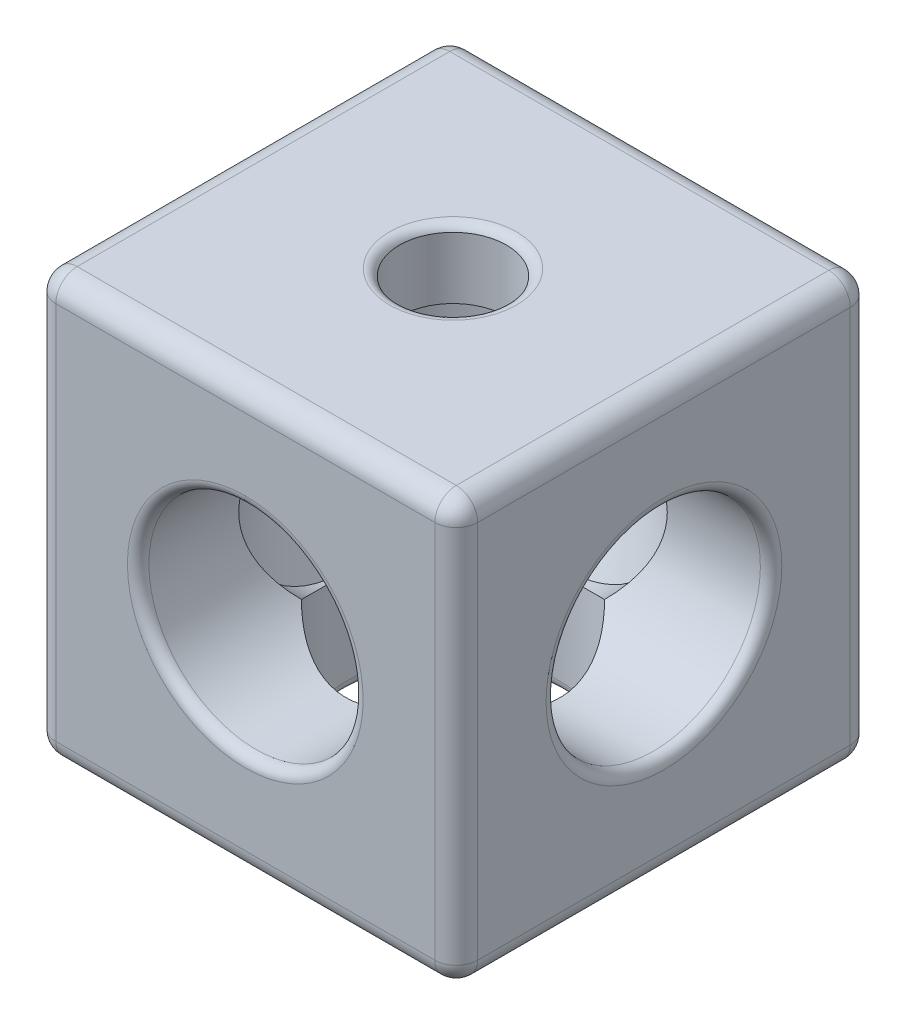
ISO-10303-21;
HEADER;
FILE_DESCRIPTION(('STEP AP214'),'2;1');
FILE_NAME('part.step','',(''),(''),'','','');
FILE_SCHEMA(('AUTOMOTIVE_DESIGN { 1 0 10303 214 1 1 1 1 }'));
ENDSEC;
DATA;
#1=APPLICATION_CONTEXT('core data for automotive mechanical design processes');
#2=APPLICATION_PROTOCOL_DEFINITION('international standard','automotive_design',2000,#1);
#3=PRODUCT_CONTEXT('',#1,'mechanical');
#4=PRODUCT('Part','Part','',(#3));
#5=PRODUCT_RELATED_PRODUCT_CATEGORY('part','',(#4));
#6=PRODUCT_DEFINITION_FORMATION('','',#4);
#7=PRODUCT_DEFINITION_CONTEXT('part definition',#1,'design');
#8=PRODUCT_DEFINITION('design','',#6,#7);
#9=PRODUCT_DEFINITION_SHAPE('','',#8);
#10=(LENGTH_UNIT() NAMED_UNIT(*) SI_UNIT(.MILLI.,.METRE.));
#11=(NAMED_UNIT(*) PLANE_ANGLE_UNIT() SI_UNIT($,.RADIAN.));
#12=(NAMED_UNIT(*) SI_UNIT($,.STERADIAN.) SOLID_ANGLE_UNIT());
#13=UNCERTAINTY_MEASURE_WITH_UNIT(LENGTH_MEASURE(1.E-05),#10,'distance_accuracy_value','');
#14=(GEOMETRIC_REPRESENTATION_CONTEXT(3) GLOBAL_UNCERTAINTY_ASSIGNED_CONTEXT((#13)) GLOBAL_UNIT_ASSIGNED_CONTEXT((#10,
#11,#12)) REPRESENTATION_CONTEXT('',''));
#15=CARTESIAN_POINT('',(0.,0.,0.));
#16=DIRECTION('',(0.,0.,1.));
#17=DIRECTION('',(1.,0.,0.));
#18=AXIS2_PLACEMENT_3D('',#15,#16,#17);
#19=CARTESIAN_POINT('',(23.733125,1.27,0.));
#20=DIRECTION('',(0.,0.,1.));
#21=DIRECTION('',(0.,-1.,0.));
#22=AXIS2_PLACEMENT_3D('',#19,#20,#21);
#23=CYLINDRICAL_SURFACE('',#22,1.27);
#24=CARTESIAN_POINT('',(23.733125,1.27,23.3484615384615));
#25=DIRECTION('',(0.,0.,1.));
#26=DIRECTION('',(0.,-1.,0.));
#27=AXIS2_PLACEMENT_3D('',#24,#25,#26);
#28=CIRCLE('',#27,1.27);
#29=CARTESIAN_POINT('',(23.733125,0.,23.3484615384615));
#30=VERTEX_POINT('',#29);
#31=CARTESIAN_POINT('',(25.003125,1.27,23.3484615384615));
#32=VERTEX_POINT('',#31);
#33=EDGE_CURVE('E10',#30,#32,#28,.T.);
#34=ORIENTED_EDGE('',*,*,#33,.F.);
#35=DIRECTION('',(0.,0.,1.));
#36=VECTOR('',#35,1.);
#37=CARTESIAN_POINT('',(23.733125,0.,0.));
#38=LINE('',#37,#36);
#39=CARTESIAN_POINT('',(23.733125,0.,1.27));
#40=VERTEX_POINT('',#39);
#41=EDGE_CURVE('E24',#40,#30,#38,.T.);
#42=ORIENTED_EDGE('',*,*,#41,.F.);
#43=CARTESIAN_POINT('',(23.733125,1.27,1.27));
#44=DIRECTION('',(0.,0.,-1.));
#45=DIRECTION('',(0.,-1.,0.));
#46=AXIS2_PLACEMENT_3D('',#43,#44,#45);
#47=CIRCLE('',#46,1.27);
#48=CARTESIAN_POINT('',(25.003125,1.27,1.27));
#49=VERTEX_POINT('',#48);
#50=EDGE_CURVE('E382',#49,#40,#47,.T.);
#51=ORIENTED_EDGE('',*,*,#50,.F.);
#52=DIRECTION('',(0.,0.,1.));
#53=VECTOR('',#52,1.);
#54=CARTESIAN_POINT('',(25.003125,1.27,0.));
#55=LINE('',#54,#53);
#56=EDGE_CURVE('E378',#49,#32,#55,.T.);
#57=ORIENTED_EDGE('',*,*,#56,.T.);
#58=EDGE_LOOP('',(#34,#42,#51,#57));
#59=FACE_BOUND('',#58,.T.);
#60=ADVANCED_FACE('F16',(#59),#23,.T.);
#61=CARTESIAN_POINT('',(1.27,1.27,0.));
#62=DIRECTION('',(0.,0.,1.));
#63=DIRECTION('',(-1.,0.,0.));
#64=AXIS2_PLACEMENT_3D('',#61,#62,#63);
#65=CYLINDRICAL_SURFACE('',#64,1.27);
#66=CARTESIAN_POINT('',(1.27,1.27,23.3484615384615));
#67=DIRECTION('',(0.,0.,1.));
#68=DIRECTION('',(-1.,0.,0.));
#69=AXIS2_PLACEMENT_3D('',#66,#67,#68);
#70=CIRCLE('',#69,1.27);
#71=CARTESIAN_POINT('',(0.,1.27,23.3484615384615));
#72=VERTEX_POINT('',#71);
#73=CARTESIAN_POINT('',(1.27,0.,23.3484615384615));
#74=VERTEX_POINT('',#73);
#75=EDGE_CURVE('E373',#72,#74,#70,.T.);
#76=ORIENTED_EDGE('',*,*,#75,.F.);
#77=DIRECTION('',(0.,0.,1.));
#78=VECTOR('',#77,1.);
#79=CARTESIAN_POINT('',(0.,1.27,0.));
#80=LINE('',#79,#78);
#81=CARTESIAN_POINT('',(0.,1.27,1.27));
#82=VERTEX_POINT('',#81);
#83=EDGE_CURVE('E368',#82,#72,#80,.T.);
#84=ORIENTED_EDGE('',*,*,#83,.F.);
#85=CARTESIAN_POINT('',(1.27,1.27,1.27));
#86=DIRECTION('',(0.,0.,-1.));
#87=DIRECTION('',(-1.,0.,0.));
#88=AXIS2_PLACEMENT_3D('',#85,#86,#87);
#89=CIRCLE('',#88,1.27);
#90=CARTESIAN_POINT('',(1.27,0.,1.27));
#91=VERTEX_POINT('',#90);
#92=EDGE_CURVE('E365',#91,#82,#89,.T.);
#93=ORIENTED_EDGE('',*,*,#92,.F.);
#94=DIRECTION('',(0.,0.,1.));
#95=VECTOR('',#94,1.);
#96=CARTESIAN_POINT('',(1.27,0.,0.));
#97=LINE('',#96,#95);
#98=EDGE_CURVE('E363',#91,#74,#97,.T.);
#99=ORIENTED_EDGE('',*,*,#98,.T.);
#100=EDGE_LOOP('',(#76,#84,#93,#99));
#101=FACE_BOUND('',#100,.T.);
#102=ADVANCED_FACE('F442',(#101),#65,.T.);
#103=CARTESIAN_POINT('',(23.733125,23.733125,1.27));
#104=DIRECTION('',(-0.816496580927721,0.408248290463875,-0.408248290463861));
#105=DIRECTION('',(0.577350269189632,0.577350269189632,-0.577350269189613));
#106=AXIS2_PLACEMENT_3D('',#103,#104,#105);
#107=SPHERICAL_SURFACE('',#106,1.27);
#108=CARTESIAN_POINT('',(23.733125,23.733125,1.27));
#109=DIRECTION('',(-1.,0.,0.));
#110=DIRECTION('',(0.,1.,0.));
#111=AXIS2_PLACEMENT_3D('',#108,#109,#110);
#112=CIRCLE('',#111,1.27);
#113=CARTESIAN_POINT('',(23.733125,25.003125,1.27));
#114=VERTEX_POINT('',#113);
#115=CARTESIAN_POINT('',(23.733125,23.733125,0.));
#116=VERTEX_POINT('',#115);
#117=EDGE_CURVE('E358',#114,#116,#112,.T.);
#118=ORIENTED_EDGE('',*,*,#117,.F.);
#119=CARTESIAN_POINT('',(23.733125,23.733125,1.27));
#120=DIRECTION('',(0.,0.,-1.));
#121=DIRECTION('',(1.,0.,0.));
#122=AXIS2_PLACEMENT_3D('',#119,#120,#121);
#123=CIRCLE('',#122,1.27000000000001);
#124=CARTESIAN_POINT('',(25.003125,23.733125,1.27));
#125=VERTEX_POINT('',#124);
#126=EDGE_CURVE('E354',#114,#125,#123,.T.);
#127=ORIENTED_EDGE('',*,*,#126,.T.);
#128=CARTESIAN_POINT('',(23.733125,23.733125,1.27));
#129=DIRECTION('',(0.,-1.,0.));
#130=DIRECTION('',(0.,0.,-1.));
#131=AXIS2_PLACEMENT_3D('',#128,#129,#130);
#132=CIRCLE('',#131,1.27);
#133=EDGE_CURVE('E349',#116,#125,#132,.T.);
#134=ORIENTED_EDGE('',*,*,#133,.F.);
#135=EDGE_LOOP('',(#118,#127,#134));
#136=FACE_BOUND('',#135,.T.);
#137=ADVANCED_FACE('F455',(#136),#107,.T.);
#138=CARTESIAN_POINT('',(23.733125,1.27,1.27));
#139=DIRECTION('',(-0.816496580927723,-0.408248290463871,-0.408248290463861));
#140=DIRECTION('',(0.57735026918963,-0.577350269189631,-0.577350269189617));
#141=AXIS2_PLACEMENT_3D('',#138,#139,#140);
#142=SPHERICAL_SURFACE('',#141,1.27);
#143=CARTESIAN_POINT('',(23.733125,1.27,1.27));
#144=DIRECTION('',(0.,1.,0.));
#145=DIRECTION('',(1.,0.,0.));
#146=AXIS2_PLACEMENT_3D('',#143,#144,#145);
#147=CIRCLE('',#146,1.27);
#148=CARTESIAN_POINT('',(23.733125,1.27,0.));
#149=VERTEX_POINT('',#148);
#150=EDGE_CURVE('E346',#49,#149,#147,.T.);
#151=ORIENTED_EDGE('',*,*,#150,.F.);
#152=ORIENTED_EDGE('',*,*,#50,.T.);
#153=CARTESIAN_POINT('',(23.733125,1.27,1.27));
#154=DIRECTION('',(-1.,0.,0.));
#155=DIRECTION('',(0.,0.,-1.));
#156=AXIS2_PLACEMENT_3D('',#153,#154,#155);
#157=CIRCLE('',#156,1.27);
#158=EDGE_CURVE('E343',#149,#40,#157,.T.);
#159=ORIENTED_EDGE('',*,*,#158,.F.);
#160=EDGE_LOOP('',(#151,#152,#159));
#161=FACE_BOUND('',#160,.T.);
#162=ADVANCED_FACE('F400',(#161),#142,.T.);
#163=CARTESIAN_POINT('',(23.733125,6.88578125,1.27));
#164=DIRECTION('',(0.,1.,0.));
#165=DIRECTION('',(0.707106781186549,0.,-0.707106781186546));
#166=AXIS2_PLACEMENT_3D('',#163,#164,#165);
#167=CYLINDRICAL_SURFACE('',#166,1.27);
#168=ORIENTED_EDGE('',*,*,#150,.T.);
#169=DIRECTION('',(0.,1.,0.));
#170=VECTOR('',#169,1.);
#171=CARTESIAN_POINT('',(23.733125,6.88578125,0.));
#172=LINE('',#171,#170);
#173=EDGE_CURVE('E338',#149,#116,#172,.T.);
#174=ORIENTED_EDGE('',*,*,#173,.T.);
#175=ORIENTED_EDGE('',*,*,#133,.T.);
#176=DIRECTION('',(0.,-1.,0.));
#177=VECTOR('',#176,1.);
#178=CARTESIAN_POINT('',(25.003125,6.88578125,1.27));
#179=LINE('',#178,#177);
#180=EDGE_CURVE('E335',#125,#49,#179,.T.);
#181=ORIENTED_EDGE('',*,*,#180,.T.);
#182=EDGE_LOOP('',(#168,#174,#175,#181));
#183=FACE_BOUND('',#182,.T.);
#184=ADVANCED_FACE('F402',(#183),#167,.T.);
#185=CARTESIAN_POINT('',(1.27,1.27,1.27));
#186=DIRECTION('',(-0.816496580927726,0.408248290463864,0.408248290463862));
#187=DIRECTION('',(-0.577350269189625,-0.577350269189627,-0.577350269189625));
#188=AXIS2_PLACEMENT_3D('',#185,#186,#187);
#189=SPHERICAL_SURFACE('',#188,1.27);
#190=CARTESIAN_POINT('',(1.27,1.27,1.27));
#191=DIRECTION('',(1.,0.,0.));
#192=DIRECTION('',(0.,-1.,0.));
#193=AXIS2_PLACEMENT_3D('',#190,#191,#192);
#194=CIRCLE('',#193,1.27);
#195=CARTESIAN_POINT('',(1.27,1.27,0.));
#196=VERTEX_POINT('',#195);
#197=EDGE_CURVE('E330',#91,#196,#194,.T.);
#198=ORIENTED_EDGE('',*,*,#197,.F.);
#199=ORIENTED_EDGE('',*,*,#92,.T.);
#200=CARTESIAN_POINT('',(1.27,1.27,1.27));
#201=DIRECTION('',(0.,1.,0.));
#202=DIRECTION('',(0.,0.,-1.));
#203=AXIS2_PLACEMENT_3D('',#200,#201,#202);
#204=CIRCLE('',#203,1.27);
#205=EDGE_CURVE('E327',#196,#82,#204,.T.);
#206=ORIENTED_EDGE('',*,*,#205,.F.);
#207=EDGE_LOOP('',(#198,#199,#206));
#208=FACE_BOUND('',#207,.T.);
#209=ADVANCED_FACE('F444',(#208),#189,.T.);
#210=CARTESIAN_POINT('',(6.88578125,1.27,1.27));
#211=DIRECTION('',(1.,0.,0.));
#212=DIRECTION('',(0.,-0.707106781186547,-0.707106781186548));
#213=AXIS2_PLACEMENT_3D('',#210,#211,#212);
#214=CYLINDRICAL_SURFACE('',#213,1.27);
#215=ORIENTED_EDGE('',*,*,#197,.T.);
#216=DIRECTION('',(1.,0.,0.));
#217=VECTOR('',#216,1.);
#218=CARTESIAN_POINT('',(6.88578125,1.27,0.));
#219=LINE('',#218,#217);
#220=EDGE_CURVE('E324',#196,#149,#219,.T.);
#221=ORIENTED_EDGE('',*,*,#220,.T.);
#222=ORIENTED_EDGE('',*,*,#158,.T.);
#223=DIRECTION('',(-1.,0.,0.));
#224=VECTOR('',#223,1.);
#225=CARTESIAN_POINT('',(6.88578125,0.,1.27));
#226=LINE('',#225,#224);
#227=EDGE_CURVE('E319',#40,#91,#226,.T.);
#228=ORIENTED_EDGE('',*,*,#227,.T.);
#229=EDGE_LOOP('',(#215,#221,#222,#228));
#230=FACE_BOUND('',#229,.T.);
#231=ADVANCED_FACE('F394',(#230),#214,.T.);
#232=CARTESIAN_POINT('',(1.27,23.733125,1.27));
#233=DIRECTION('',(-0.816496580927724,-0.408248290463868,0.408248290463862));
#234=DIRECTION('',(-0.577350269189628,0.577350269189629,-0.57735026918962));
#235=AXIS2_PLACEMENT_3D('',#232,#233,#234);
#236=SPHERICAL_SURFACE('',#235,1.27);
#237=CARTESIAN_POINT('',(1.27,23.733125,1.27));
#238=DIRECTION('',(0.,-1.,0.));
#239=DIRECTION('',(-1.,0.,0.));
#240=AXIS2_PLACEMENT_3D('',#237,#238,#239);
#241=CIRCLE('',#240,1.27);
#242=CARTESIAN_POINT('',(0.,23.733125,1.27));
#243=VERTEX_POINT('',#242);
#244=CARTESIAN_POINT('',(1.27,23.733125,0.));
#245=VERTEX_POINT('',#244);
#246=EDGE_CURVE('E314',#243,#245,#241,.T.);
#247=ORIENTED_EDGE('',*,*,#246,.F.);
#248=CARTESIAN_POINT('',(1.27,23.733125,1.27));
#249=DIRECTION('',(0.,0.,-1.));
#250=DIRECTION('',(0.,1.,0.));
#251=AXIS2_PLACEMENT_3D('',#248,#249,#250);
#252=CIRCLE('',#251,1.27);
#253=CARTESIAN_POINT('',(1.27,25.003125,1.27));
#254=VERTEX_POINT('',#253);
#255=EDGE_CURVE('E312',#243,#254,#252,.T.);
#256=ORIENTED_EDGE('',*,*,#255,.T.);
#257=CARTESIAN_POINT('',(1.27,23.733125,1.27));
#258=DIRECTION('',(1.,0.,0.));
#259=DIRECTION('',(0.,0.,-1.));
#260=AXIS2_PLACEMENT_3D('',#257,#258,#259);
#261=CIRCLE('',#260,1.27);
#262=EDGE_CURVE('E309',#245,#254,#261,.T.);
#263=ORIENTED_EDGE('',*,*,#262,.F.);
#264=EDGE_LOOP('',(#247,#256,#263));
#265=FACE_BOUND('',#264,.T.);
#266=ADVANCED_FACE('F495',(#265),#236,.T.);
#267=CARTESIAN_POINT('',(1.27,18.11734375,1.27));
#268=DIRECTION('',(0.,-1.,0.));
#269=DIRECTION('',(-0.707106781186547,0.,-0.707106781186548));
#270=AXIS2_PLACEMENT_3D('',#267,#268,#269);
#271=CYLINDRICAL_SURFACE('',#270,1.27);
#272=ORIENTED_EDGE('',*,*,#246,.T.);
#273=DIRECTION('',(0.,-1.,0.));
#274=VECTOR('',#273,1.);
#275=CARTESIAN_POINT('',(1.27,18.11734375,0.));
#276=LINE('',#275,#274);
#277=EDGE_CURVE('E304',#245,#196,#276,.T.);
#278=ORIENTED_EDGE('',*,*,#277,.T.);
#279=ORIENTED_EDGE('',*,*,#205,.T.);
#280=DIRECTION('',(0.,1.,0.));
#281=VECTOR('',#280,1.);
#282=CARTESIAN_POINT('',(0.,18.11734375,1.27));
#283=LINE('',#282,#281);
#284=EDGE_CURVE('E301',#82,#243,#283,.T.);
#285=ORIENTED_EDGE('',*,*,#284,.T.);
#286=EDGE_LOOP('',(#272,#278,#279,#285));
#287=FACE_BOUND('',#286,.T.);
#288=ADVANCED_FACE('F446',(#287),#271,.T.);
#289=CARTESIAN_POINT('',(18.11734375,23.733125,1.27));
#290=DIRECTION('',(-1.,0.,0.));
#291=DIRECTION('',(0.,0.707106781186549,-0.707106781186546));
#292=AXIS2_PLACEMENT_3D('',#289,#290,#291);
#293=CYLINDRICAL_SURFACE('',#292,1.27);
#294=ORIENTED_EDGE('',*,*,#117,.T.);
#295=DIRECTION('',(-1.,0.,0.));
#296=VECTOR('',#295,1.);
#297=CARTESIAN_POINT('',(18.11734375,23.733125,0.));
#298=LINE('',#297,#296);
#299=EDGE_CURVE('E298',#116,#245,#298,.T.);
#300=ORIENTED_EDGE('',*,*,#299,.T.);
#301=ORIENTED_EDGE('',*,*,#262,.T.);
#302=DIRECTION('',(1.,0.,0.));
#303=VECTOR('',#302,1.);
#304=CARTESIAN_POINT('',(18.11734375,25.003125,1.27));
#305=LINE('',#304,#303);
#306=EDGE_CURVE('E293',#254,#114,#305,.T.);
#307=ORIENTED_EDGE('',*,*,#306,.T.);
#308=EDGE_LOOP('',(#294,#300,#301,#307));
#309=FACE_BOUND('',#308,.T.);
#310=ADVANCED_FACE('F452',(#309),#293,.T.);
#311=CARTESIAN_POINT('',(23.733125,23.733125,0.));
#312=DIRECTION('',(0.,0.,1.));
#313=DIRECTION('',(1.,0.,0.));
#314=AXIS2_PLACEMENT_3D('',#311,#312,#313);
#315=CYLINDRICAL_SURFACE('',#314,1.27000000000001);
#316=CARTESIAN_POINT('',(23.733125,23.733125,23.3484615384615));
#317=DIRECTION('',(0.,0.,1.));
#318=DIRECTION('',(1.,0.,0.));
#319=AXIS2_PLACEMENT_3D('',#316,#317,#318);
#320=CIRCLE('',#319,1.27000000000001);
#321=CARTESIAN_POINT('',(25.003125,23.733125,23.3484615384615));
#322=VERTEX_POINT('',#321);
#323=CARTESIAN_POINT('',(23.733125,25.003125,23.3484615384615));
#324=VERTEX_POINT('',#323);
#325=EDGE_CURVE('E288',#322,#324,#320,.T.);
#326=ORIENTED_EDGE('',*,*,#325,.F.);
#327=DIRECTION('',(0.,0.,1.));
#328=VECTOR('',#327,1.);
#329=CARTESIAN_POINT('',(25.003125,23.733125,0.));
#330=LINE('',#329,#328);
#331=EDGE_CURVE('E285',#125,#322,#330,.T.);
#332=ORIENTED_EDGE('',*,*,#331,.F.);
#333=ORIENTED_EDGE('',*,*,#126,.F.);
#334=DIRECTION('',(0.,0.,1.));
#335=VECTOR('',#334,1.);
#336=CARTESIAN_POINT('',(23.733125,25.003125,0.));
#337=LINE('',#336,#335);
#338=EDGE_CURVE('E281',#114,#324,#337,.T.);
#339=ORIENTED_EDGE('',*,*,#338,.T.);
#340=EDGE_LOOP('',(#326,#332,#333,#339));
#341=FACE_BOUND('',#340,.T.);
#342=ADVANCED_FACE('F458',(#341),#315,.T.);
#343=CARTESIAN_POINT('',(1.27,23.733125,0.));
#344=DIRECTION('',(0.,0.,1.));
#345=DIRECTION('',(0.,1.,0.));
#346=AXIS2_PLACEMENT_3D('',#343,#344,#345);
#347=CYLINDRICAL_SURFACE('',#346,1.27);
#348=CARTESIAN_POINT('',(1.27,23.733125,23.3484615384615));
#349=DIRECTION('',(0.,0.,1.));
#350=DIRECTION('',(0.,1.,0.));
#351=AXIS2_PLACEMENT_3D('',#348,#349,#350);
#352=CIRCLE('',#351,1.27);
#353=CARTESIAN_POINT('',(1.27,25.003125,23.3484615384615));
#354=VERTEX_POINT('',#353);
#355=CARTESIAN_POINT('',(0.,23.733125,23.3484615384615));
#356=VERTEX_POINT('',#355);
#357=EDGE_CURVE('E278',#354,#356,#352,.T.);
#358=ORIENTED_EDGE('',*,*,#357,.F.);
#359=DIRECTION('',(0.,0.,1.));
#360=VECTOR('',#359,1.);
#361=CARTESIAN_POINT('',(1.27,25.003125,0.));
#362=LINE('',#361,#360);
#363=EDGE_CURVE('E273',#254,#354,#362,.T.);
#364=ORIENTED_EDGE('',*,*,#363,.F.);
#365=ORIENTED_EDGE('',*,*,#255,.F.);
#366=DIRECTION('',(0.,0.,1.));
#367=VECTOR('',#366,1.);
#368=CARTESIAN_POINT('',(0.,23.733125,0.));
#369=LINE('',#368,#367);
#370=EDGE_CURVE('E271',#243,#356,#369,.T.);
#371=ORIENTED_EDGE('',*,*,#370,.T.);
#372=EDGE_LOOP('',(#358,#364,#365,#371));
#373=FACE_BOUND('',#372,.T.);
#374=ADVANCED_FACE('F434',(#373),#347,.T.);
#375=CARTESIAN_POINT('',(23.733125,23.733125,23.3484615384615));
#376=DIRECTION('',(-0.816496580927722,0.408248290463875,0.40824829046386));
#377=DIRECTION('',(0.577350269189633,0.577350269189633,0.577350269189613));
#378=AXIS2_PLACEMENT_3D('',#375,#376,#377);
#379=SPHERICAL_SURFACE('',#378,1.27);
#380=CARTESIAN_POINT('',(23.733125,23.733125,23.3484615384615));
#381=DIRECTION('',(-1.,0.,0.));
#382=DIRECTION('',(0.,0.,1.));
#383=AXIS2_PLACEMENT_3D('',#380,#381,#382);
#384=CIRCLE('',#383,1.27);
#385=CARTESIAN_POINT('',(23.733125,23.733125,24.6184615384616));
#386=VERTEX_POINT('',#385);
#387=EDGE_CURVE('E266',#386,#324,#384,.T.);
#388=ORIENTED_EDGE('',*,*,#387,.F.);
#389=CARTESIAN_POINT('',(23.733125,23.733125,23.3484615384615));
#390=DIRECTION('',(0.,-1.,0.));
#391=DIRECTION('',(1.,0.,0.));
#392=AXIS2_PLACEMENT_3D('',#389,#390,#391);
#393=CIRCLE('',#392,1.27);
#394=EDGE_CURVE('E261',#322,#386,#393,.T.);
#395=ORIENTED_EDGE('',*,*,#394,.F.);
#396=ORIENTED_EDGE('',*,*,#325,.T.);
#397=EDGE_LOOP('',(#388,#395,#396));
#398=FACE_BOUND('',#397,.T.);
#399=ADVANCED_FACE('F507',(#398),#379,.T.);
#400=CARTESIAN_POINT('',(23.733125,1.27,23.3484615384615));
#401=DIRECTION('',(-0.816496580927723,-0.408248290463871,0.408248290463861));
#402=DIRECTION('',(0.57735026918963,-0.577350269189631,0.577350269189616));
#403=AXIS2_PLACEMENT_3D('',#400,#401,#402);
#404=SPHERICAL_SURFACE('',#403,1.27);
#405=CARTESIAN_POINT('',(23.733125,1.27,23.3484615384615));
#406=DIRECTION('',(0.,1.,0.));
#407=DIRECTION('',(0.,0.,1.));
#408=AXIS2_PLACEMENT_3D('',#405,#406,#407);
#409=CIRCLE('',#408,1.27);
#410=CARTESIAN_POINT('',(23.733125,1.27,24.6184615384616));
#411=VERTEX_POINT('',#410);
#412=EDGE_CURVE('E258',#411,#32,#409,.T.);
#413=ORIENTED_EDGE('',*,*,#412,.F.);
#414=CARTESIAN_POINT('',(23.733125,1.27,23.3484615384615));
#415=DIRECTION('',(-1.,0.,0.));
#416=DIRECTION('',(0.,-1.,0.));
#417=AXIS2_PLACEMENT_3D('',#414,#415,#416);
#418=CIRCLE('',#417,1.27);
#419=EDGE_CURVE('E253',#30,#411,#418,.T.);
#420=ORIENTED_EDGE('',*,*,#419,.F.);
#421=ORIENTED_EDGE('',*,*,#33,.T.);
#422=EDGE_LOOP('',(#413,#420,#421));
#423=FACE_BOUND('',#422,.T.);
#424=ADVANCED_FACE('F410',(#423),#404,.T.);
#425=CARTESIAN_POINT('',(23.733125,6.88578125,23.3484615384615));
#426=DIRECTION('',(0.,1.,0.));
#427=DIRECTION('',(0.70710678118655,0.,0.707106781186545));
#428=AXIS2_PLACEMENT_3D('',#425,#426,#427);
#429=CYLINDRICAL_SURFACE('',#428,1.27);
#430=ORIENTED_EDGE('',*,*,#412,.T.);
#431=DIRECTION('',(0.,1.,0.));
#432=VECTOR('',#431,1.);
#433=CARTESIAN_POINT('',(25.003125,6.88578125,23.3484615384615));
#434=LINE('',#433,#432);
#435=EDGE_CURVE('E250',#32,#322,#434,.T.);
#436=ORIENTED_EDGE('',*,*,#435,.T.);
#437=ORIENTED_EDGE('',*,*,#394,.T.);
#438=DIRECTION('',(0.,-1.,0.));
#439=VECTOR('',#438,1.);
#440=CARTESIAN_POINT('',(23.733125,6.88578125,24.6184615384616));
#441=LINE('',#440,#439);
#442=EDGE_CURVE('E247',#386,#411,#441,.T.);
#443=ORIENTED_EDGE('',*,*,#442,.T.);
#444=EDGE_LOOP('',(#430,#436,#437,#443));
#445=FACE_BOUND('',#444,.T.);
#446=ADVANCED_FACE('F412',(#445),#429,.T.);
#447=CARTESIAN_POINT('',(1.27,1.27,23.3484615384615));
#448=DIRECTION('',(-0.816496580927726,0.408248290463864,-0.408248290463862));
#449=DIRECTION('',(-0.577350269189626,-0.577350269189627,0.577350269189625));
#450=AXIS2_PLACEMENT_3D('',#447,#448,#449);
#451=SPHERICAL_SURFACE('',#450,1.27);
#452=CARTESIAN_POINT('',(1.27,1.27,23.3484615384615));
#453=DIRECTION('',(1.,0.,0.));
#454=DIRECTION('',(0.,0.,1.));
#455=AXIS2_PLACEMENT_3D('',#452,#453,#454);
#456=CIRCLE('',#455,1.27);
#457=CARTESIAN_POINT('',(1.27,1.27,24.6184615384616));
#458=VERTEX_POINT('',#457);
#459=EDGE_CURVE('E242',#458,#74,#456,.T.);
#460=ORIENTED_EDGE('',*,*,#459,.F.);
#461=CARTESIAN_POINT('',(1.27,1.27,23.3484615384615));
#462=DIRECTION('',(0.,1.,0.));
#463=DIRECTION('',(-1.,0.,0.));
#464=AXIS2_PLACEMENT_3D('',#461,#462,#463);
#465=CIRCLE('',#464,1.27);
#466=EDGE_CURVE('E239',#72,#458,#465,.T.);
#467=ORIENTED_EDGE('',*,*,#466,.F.);
#468=ORIENTED_EDGE('',*,*,#75,.T.);
#469=EDGE_LOOP('',(#460,#467,#468));
#470=FACE_BOUND('',#469,.T.);
#471=ADVANCED_FACE('F515',(#470),#451,.T.);
#472=CARTESIAN_POINT('',(6.88578125,1.27,23.3484615384615));
#473=DIRECTION('',(1.,0.,0.));
#474=DIRECTION('',(0.,-0.707106781186548,0.707106781186547));
#475=AXIS2_PLACEMENT_3D('',#472,#473,#474);
#476=CYLINDRICAL_SURFACE('',#475,1.27);
#477=ORIENTED_EDGE('',*,*,#459,.T.);
#478=DIRECTION('',(1.,0.,0.));
#479=VECTOR('',#478,1.);
#480=CARTESIAN_POINT('',(6.88578125,0.,23.3484615384615));
#481=LINE('',#480,#479);
#482=EDGE_CURVE('E236',#74,#30,#481,.T.);
#483=ORIENTED_EDGE('',*,*,#482,.T.);
#484=ORIENTED_EDGE('',*,*,#419,.T.);
#485=DIRECTION('',(-1.,0.,0.));
#486=VECTOR('',#485,1.);
#487=CARTESIAN_POINT('',(6.88578125,1.27,24.6184615384616));
#488=LINE('',#487,#486);
#489=EDGE_CURVE('E231',#411,#458,#488,.T.);
#490=ORIENTED_EDGE('',*,*,#489,.T.);
#491=EDGE_LOOP('',(#477,#483,#484,#490));
#492=FACE_BOUND('',#491,.T.);
#493=ADVANCED_FACE('F419',(#492),#476,.T.);
#494=CARTESIAN_POINT('',(1.27,23.733125,23.3484615384615));
#495=DIRECTION('',(-0.816496580927724,-0.408248290463869,-0.408248290463862));
#496=DIRECTION('',(-0.577350269189629,0.57735026918963,0.577350269189619));
#497=AXIS2_PLACEMENT_3D('',#494,#495,#496);
#498=SPHERICAL_SURFACE('',#497,1.27);
#499=CARTESIAN_POINT('',(1.27,23.733125,23.3484615384615));
#500=DIRECTION('',(0.,-1.,0.));
#501=DIRECTION('',(0.,0.,1.));
#502=AXIS2_PLACEMENT_3D('',#499,#500,#501);
#503=CIRCLE('',#502,1.27);
#504=CARTESIAN_POINT('',(1.27,23.733125,24.6184615384616));
#505=VERTEX_POINT('',#504);
#506=EDGE_CURVE('E228',#505,#356,#503,.T.);
#507=ORIENTED_EDGE('',*,*,#506,.F.);
#508=CARTESIAN_POINT('',(1.27,23.733125,23.3484615384615));
#509=DIRECTION('',(1.,0.,0.));
#510=DIRECTION('',(0.,1.,0.));
#511=AXIS2_PLACEMENT_3D('',#508,#509,#510);
#512=CIRCLE('',#511,1.27);
#513=EDGE_CURVE('E223',#354,#505,#512,.T.);
#514=ORIENTED_EDGE('',*,*,#513,.F.);
#515=ORIENTED_EDGE('',*,*,#357,.T.);
#516=EDGE_LOOP('',(#507,#514,#515));
#517=FACE_BOUND('',#516,.T.);
#518=ADVANCED_FACE('F431',(#517),#498,.T.);
#519=CARTESIAN_POINT('',(1.27,18.11734375,23.3484615384615));
#520=DIRECTION('',(0.,-1.,0.));
#521=DIRECTION('',(-0.707106781186548,0.,0.707106781186547));
#522=AXIS2_PLACEMENT_3D('',#519,#520,#521);
#523=CYLINDRICAL_SURFACE('',#522,1.27);
#524=ORIENTED_EDGE('',*,*,#506,.T.);
#525=DIRECTION('',(0.,-1.,0.));
#526=VECTOR('',#525,1.);
#527=CARTESIAN_POINT('',(0.,18.11734375,23.3484615384615));
#528=LINE('',#527,#526);
#529=EDGE_CURVE('E220',#356,#72,#528,.T.);
#530=ORIENTED_EDGE('',*,*,#529,.T.);
#531=ORIENTED_EDGE('',*,*,#466,.T.);
#532=DIRECTION('',(0.,1.,0.));
#533=VECTOR('',#532,1.);
#534=CARTESIAN_POINT('',(1.27,18.11734375,24.6184615384616));
#535=LINE('',#534,#533);
#536=EDGE_CURVE('E217',#458,#505,#535,.T.);
#537=ORIENTED_EDGE('',*,*,#536,.T.);
#538=EDGE_LOOP('',(#524,#530,#531,#537));
#539=FACE_BOUND('',#538,.T.);
#540=ADVANCED_FACE('F423',(#539),#523,.T.);
#541=CARTESIAN_POINT('',(18.11734375,23.733125,23.3484615384615));
#542=DIRECTION('',(-1.,0.,0.));
#543=DIRECTION('',(0.,0.70710678118655,0.707106781186545));
#544=AXIS2_PLACEMENT_3D('',#541,#542,#543);
#545=CYLINDRICAL_SURFACE('',#544,1.27);
#546=ORIENTED_EDGE('',*,*,#387,.T.);
#547=DIRECTION('',(-1.,0.,0.));
#548=VECTOR('',#547,1.);
#549=CARTESIAN_POINT('',(18.11734375,25.003125,23.3484615384615));
#550=LINE('',#549,#548);
#551=EDGE_CURVE('E214',#324,#354,#550,.T.);
#552=ORIENTED_EDGE('',*,*,#551,.T.);
#553=ORIENTED_EDGE('',*,*,#513,.T.);
#554=DIRECTION('',(1.,0.,0.));
#555=VECTOR('',#554,1.);
#556=CARTESIAN_POINT('',(18.11734375,23.733125,24.6184615384616));
#557=LINE('',#556,#555);
#558=EDGE_CURVE('E211',#505,#386,#557,.T.);
#559=ORIENTED_EDGE('',*,*,#558,.T.);
#560=EDGE_LOOP('',(#546,#552,#553,#559));
#561=FACE_BOUND('',#560,.T.);
#562=ADVANCED_FACE('F428',(#561),#545,.T.);
#563=CARTESIAN_POINT('',(12.5015625,12.3063,12.3092307692308));
#564=DIRECTION('',(0.,1.,0.));
#565=DIRECTION('',(0.,0.,-1.));
#566=AXIS2_PLACEMENT_3D('',#563,#564,#565);
#567=CYLINDRICAL_SURFACE('',#566,3.175);
#568=CARTESIAN_POINT('',(12.5015625,24.6126,12.3092307692308));
#569=DIRECTION('',(0.,1.,0.));
#570=DIRECTION('',(0.,0.,-1.));
#571=AXIS2_PLACEMENT_3D('',#568,#569,#570);
#572=CIRCLE('',#571,3.175);
#573=CARTESIAN_POINT('',(12.5015625,24.6126,9.13423076923078));
#574=VERTEX_POINT('',#573);
#575=EDGE_CURVE('E208',#574,#574,#572,.T.);
#576=ORIENTED_EDGE('',*,*,#575,.T.);
#577=EDGE_LOOP('',(#576));
#578=FACE_BOUND('',#577,.T.);
#579=CARTESIAN_POINT('',(12.5015625,20.9577324654125,12.3092307692308));
#580=DIRECTION('',(0.,-1.,0.));
#581=DIRECTION('',(0.,0.,-1.));
#582=AXIS2_PLACEMENT_3D('',#579,#580,#581);
#583=CIRCLE('',#582,3.175);
#584=CARTESIAN_POINT('',(12.5015625,20.9577324654125,9.13423076923078));
#585=VERTEX_POINT('',#584);
#586=EDGE_CURVE('E205',#585,#585,#583,.T.);
#587=ORIENTED_EDGE('',*,*,#586,.T.);
#588=EDGE_LOOP('',(#587));
#589=FACE_BOUND('',#588,.T.);
#590=ADVANCED_FACE('F527',(#578,#589),#567,.F.);
#591=CARTESIAN_POINT('',(12.5015625,12.5015625,3.66072907304903));
#592=DIRECTION('',(0.,0.,1.));
#593=DIRECTION('',(1.,0.,0.));
#594=AXIS2_PLACEMENT_3D('',#591,#592,#593);
#595=CONICAL_SURFACE('',#594,3.175,1.02974425867665);
#596=CARTESIAN_POINT('',(12.5015625,12.5015625,3.66072907304903));
#597=DIRECTION('',(0.,0.,1.));
#598=DIRECTION('',(1.,0.,0.));
#599=AXIS2_PLACEMENT_3D('',#596,#597,#598);
#600=CIRCLE('',#599,3.175);
#601=CARTESIAN_POINT('',(15.6765625,12.5015625,3.66072907304903));
#602=VERTEX_POINT('',#601);
#603=EDGE_CURVE('E202',#602,#602,#600,.T.);
#604=ORIENTED_EDGE('',*,*,#603,.F.);
#605=EDGE_LOOP('',(#604));
#606=FACE_BOUND('',#605,.T.);
#607=CARTESIAN_POINT('',(12.5015625,12.5015625,5.56846153846153));
#608=DIRECTION('',(0.,0.,-1.));
#609=DIRECTION('',(1.,0.,0.));
#610=AXIS2_PLACEMENT_3D('',#607,#608,#609);
#611=CIRCLE('',#610,6.35);
#612=CARTESIAN_POINT('',(18.8515625,12.5015625,5.56846153846153));
#613=VERTEX_POINT('',#612);
#614=EDGE_CURVE('E199',#613,#613,#611,.T.);
#615=ORIENTED_EDGE('',*,*,#614,.F.);
#616=EDGE_LOOP('',(#615));
#617=FACE_BOUND('',#616,.T.);
#618=ADVANCED_FACE('F530',(#606,#617),#595,.F.);
#619=CARTESIAN_POINT('',(12.5015625,12.5015625,15.0934615384616));
#620=DIRECTION('',(0.,0.,-1.));
#621=DIRECTION('',(1.,0.,0.));
#622=AXIS2_PLACEMENT_3D('',#619,#620,#621);
#623=CYLINDRICAL_SURFACE('',#622,6.35);
#624=ORIENTED_EDGE('',*,*,#614,.T.);
#625=EDGE_LOOP('',(#624));
#626=FACE_BOUND('',#625,.T.);
#627=CARTESIAN_POINT('',(12.5015625,12.5015625,12.3092307692308));
#628=DIRECTION('',(0.707106781186548,0.,0.707106781186548));
#629=DIRECTION('',(0.707106781186548,0.,-0.707106781186548));
#630=AXIS2_PLACEMENT_3D('',#627,#628,#629);
#631=ELLIPSE('',#630,8.98025612106916,6.35);
#632=CARTESIAN_POINT('',(16.9916905605346,8.01143443946542,7.8191027086962));
#633=VERTEX_POINT('',#632);
#634=CARTESIAN_POINT('',(16.9916905605346,16.9916905605346,7.8191027086962));
#635=VERTEX_POINT('',#634);
#636=EDGE_CURVE('E152',#633,#635,#631,.T.);
#637=ORIENTED_EDGE('',*,*,#636,.T.);
#638=CARTESIAN_POINT('',(12.5015625,12.5015625,12.3092307692308));
#639=DIRECTION('',(0.,0.707106781186548,0.707106781186548));
#640=DIRECTION('',(0.,0.707106781186548,-0.707106781186548));
#641=AXIS2_PLACEMENT_3D('',#638,#639,#640);
#642=ELLIPSE('',#641,8.98025612106916,6.35);
#643=CARTESIAN_POINT('',(8.01143443946542,16.9916905605346,7.8191027086962));
#644=VERTEX_POINT('',#643);
#645=EDGE_CURVE('E194',#635,#644,#642,.T.);
#646=ORIENTED_EDGE('',*,*,#645,.T.);
#647=CARTESIAN_POINT('',(12.5015625,12.5015625,12.3092307692308));
#648=DIRECTION('',(-0.707106781186548,0.,0.707106781186548));
#649=DIRECTION('',(-0.707106781186548,0.,-0.707106781186548));
#650=AXIS2_PLACEMENT_3D('',#647,#648,#649);
#651=ELLIPSE('',#650,8.98025612106916,6.35);
#652=CARTESIAN_POINT('',(8.01143443946542,8.01143443946542,7.8191027086962));
#653=VERTEX_POINT('',#652);
#654=EDGE_CURVE('E192',#644,#653,#651,.T.);
#655=ORIENTED_EDGE('',*,*,#654,.T.);
#656=CARTESIAN_POINT('',(12.5015625,12.5015625,12.3092307692308));
#657=DIRECTION('',(0.,-0.707106781186548,0.707106781186548));
#658=DIRECTION('',(0.,-0.707106781186548,-0.707106781186548));
#659=AXIS2_PLACEMENT_3D('',#656,#657,#658);
#660=ELLIPSE('',#659,8.98025612106916,6.35);
#661=EDGE_CURVE('E190',#653,#633,#660,.T.);
#662=ORIENTED_EDGE('',*,*,#661,.T.);
#663=EDGE_LOOP('',(#637,#646,#655,#662));
#664=FACE_BOUND('',#663,.T.);
#665=ADVANCED_FACE('F534',(#626,#664),#623,.F.);
#666=CARTESIAN_POINT('',(12.696825,12.5015625,12.3092307692308));
#667=DIRECTION('',(-1.,0.,0.));
#668=DIRECTION('',(0.,1.,0.));
#669=AXIS2_PLACEMENT_3D('',#666,#667,#668);
#670=CYLINDRICAL_SURFACE('',#669,3.175);
#671=CARTESIAN_POINT('',(0.390525,12.5015625,12.3092307692308));
#672=DIRECTION('',(-1.,0.,0.));
#673=DIRECTION('',(0.,1.,0.));
#674=AXIS2_PLACEMENT_3D('',#671,#672,#673);
#675=CIRCLE('',#674,3.175);
#676=CARTESIAN_POINT('',(0.390525,15.6765625,12.3092307692308));
#677=VERTEX_POINT('',#676);
#678=EDGE_CURVE('E187',#677,#677,#675,.T.);
#679=ORIENTED_EDGE('',*,*,#678,.T.);
#680=EDGE_LOOP('',(#679));
#681=FACE_BOUND('',#680,.T.);
#682=CARTESIAN_POINT('',(4.04539253458749,12.5015625,12.3092307692308));
#683=DIRECTION('',(1.,0.,0.));
#684=DIRECTION('',(0.,1.,0.));
#685=AXIS2_PLACEMENT_3D('',#682,#683,#684);
#686=CIRCLE('',#685,3.175);
#687=CARTESIAN_POINT('',(4.04539253458749,15.6765625,12.3092307692308));
#688=VERTEX_POINT('',#687);
#689=EDGE_CURVE('E184',#688,#688,#686,.T.);
#690=ORIENTED_EDGE('',*,*,#689,.T.);
#691=EDGE_LOOP('',(#690));
#692=FACE_BOUND('',#691,.T.);
#693=ADVANCED_FACE('F539',(#681,#692),#670,.F.);
#694=CARTESIAN_POINT('',(12.5015625,20.9577324654125,12.3092307692308));
#695=DIRECTION('',(0.,-1.,0.));
#696=DIRECTION('',(0.,0.,-1.));
#697=AXIS2_PLACEMENT_3D('',#694,#695,#696);
#698=CONICAL_SURFACE('',#697,3.175,1.02974425867665);
#699=ORIENTED_EDGE('',*,*,#586,.F.);
#700=EDGE_LOOP('',(#699));
#701=FACE_BOUND('',#700,.T.);
#702=CARTESIAN_POINT('',(12.5015625,19.05,12.3092307692308));
#703=DIRECTION('',(0.,1.,0.));
#704=DIRECTION('',(0.,0.,-1.));
#705=AXIS2_PLACEMENT_3D('',#702,#703,#704);
#706=CIRCLE('',#705,6.35);
#707=CARTESIAN_POINT('',(12.5015625,19.05,5.95923076923078));
#708=VERTEX_POINT('',#707);
#709=EDGE_CURVE('E181',#708,#708,#706,.T.);
#710=ORIENTED_EDGE('',*,*,#709,.F.);
#711=EDGE_LOOP('',(#710));
#712=FACE_BOUND('',#711,.T.);
#713=ADVANCED_FACE('F542',(#701,#712),#698,.F.);
#714=CARTESIAN_POINT('',(12.5015625,9.525,12.3092307692308));
#715=DIRECTION('',(0.,1.,0.));
#716=DIRECTION('',(0.,0.,-1.));
#717=AXIS2_PLACEMENT_3D('',#714,#715,#716);
#718=CYLINDRICAL_SURFACE('',#717,6.35);
#719=ORIENTED_EDGE('',*,*,#709,.T.);
#720=EDGE_LOOP('',(#719));
#721=FACE_BOUND('',#720,.T.);
#722=CARTESIAN_POINT('',(12.5015625,12.5015625,12.3092307692308));
#723=DIRECTION('',(0.707106781186548,-0.707106781186548,0.));
#724=DIRECTION('',(0.707106781186548,0.707106781186548,0.));
#725=AXIS2_PLACEMENT_3D('',#722,#723,#724);
#726=ELLIPSE('',#725,8.98025612106916,6.35);
#727=CARTESIAN_POINT('',(16.9916905605346,16.9916905605346,16.7993588297653));
#728=VERTEX_POINT('',#727);
#729=EDGE_CURVE('E179',#635,#728,#726,.T.);
#730=ORIENTED_EDGE('',*,*,#729,.T.);
#731=CARTESIAN_POINT('',(12.5015625,12.5015625,12.3092307692308));
#732=DIRECTION('',(0.,0.707106781186548,-0.707106781186548));
#733=DIRECTION('',(0.,-0.707106781186548,-0.707106781186548));
#734=AXIS2_PLACEMENT_3D('',#731,#732,#733);
#735=ELLIPSE('',#734,8.98025612106916,6.35);
#736=CARTESIAN_POINT('',(8.01143443946542,16.9916905605346,16.7993588297653));
#737=VERTEX_POINT('',#736);
#738=EDGE_CURVE('E133',#737,#728,#735,.T.);
#739=ORIENTED_EDGE('',*,*,#738,.F.);
#740=CARTESIAN_POINT('',(12.5015625,12.5015625,12.3092307692308));
#741=DIRECTION('',(-0.707106781186548,-0.707106781186547,0.));
#742=DIRECTION('',(-0.707106781186548,0.707106781186548,0.));
#743=AXIS2_PLACEMENT_3D('',#740,#741,#742);
#744=ELLIPSE('',#743,8.98025612106916,6.35);
#745=EDGE_CURVE('E175',#737,#644,#744,.T.);
#746=ORIENTED_EDGE('',*,*,#745,.T.);
#747=ORIENTED_EDGE('',*,*,#645,.F.);
#748=EDGE_LOOP('',(#730,#739,#746,#747));
#749=FACE_BOUND('',#748,.T.);
#750=ADVANCED_FACE('F546',(#721,#749),#718,.F.);
#751=CARTESIAN_POINT('',(4.04539253458749,12.5015625,12.3092307692308));
#752=DIRECTION('',(1.,0.,0.));
#753=DIRECTION('',(0.,1.,0.));
#754=AXIS2_PLACEMENT_3D('',#751,#752,#753);
#755=CONICAL_SURFACE('',#754,3.175,1.02974425867665);
#756=ORIENTED_EDGE('',*,*,#689,.F.);
#757=EDGE_LOOP('',(#756));
#758=FACE_BOUND('',#757,.T.);
#759=CARTESIAN_POINT('',(5.953125,12.5015625,12.3092307692308));
#760=DIRECTION('',(-1.,0.,0.));
#761=DIRECTION('',(0.,1.,0.));
#762=AXIS2_PLACEMENT_3D('',#759,#760,#761);
#763=CIRCLE('',#762,6.35);
#764=CARTESIAN_POINT('',(5.953125,18.8515625,12.3092307692308));
#765=VERTEX_POINT('',#764);
#766=EDGE_CURVE('E172',#765,#765,#763,.T.);
#767=ORIENTED_EDGE('',*,*,#766,.F.);
#768=EDGE_LOOP('',(#767));
#769=FACE_BOUND('',#768,.T.);
#770=ADVANCED_FACE('F551',(#758,#769),#755,.F.);
#771=CARTESIAN_POINT('',(15.478125,12.5015625,12.3092307692308));
#772=DIRECTION('',(-1.,0.,0.));
#773=DIRECTION('',(0.,1.,0.));
#774=AXIS2_PLACEMENT_3D('',#771,#772,#773);
#775=CYLINDRICAL_SURFACE('',#774,6.35);
#776=ORIENTED_EDGE('',*,*,#766,.T.);
#777=EDGE_LOOP('',(#776));
#778=FACE_BOUND('',#777,.T.);
#779=CARTESIAN_POINT('',(12.5015625,12.5015625,12.3092307692308));
#780=DIRECTION('',(-0.707106781186548,0.707106781186548,0.));
#781=DIRECTION('',(0.707106781186548,0.707106781186548,0.));
#782=AXIS2_PLACEMENT_3D('',#779,#780,#781);
#783=ELLIPSE('',#782,8.98025612106916,6.35);
#784=CARTESIAN_POINT('',(8.01143443946542,8.01143443946542,16.7993588297653));
#785=VERTEX_POINT('',#784);
#786=EDGE_CURVE('E147',#653,#785,#783,.T.);
#787=ORIENTED_EDGE('',*,*,#786,.F.);
#788=ORIENTED_EDGE('',*,*,#654,.F.);
#789=ORIENTED_EDGE('',*,*,#745,.F.);
#790=CARTESIAN_POINT('',(12.5015625,12.5015625,12.3092307692308));
#791=DIRECTION('',(-0.707106781186548,0.,-0.707106781186548));
#792=DIRECTION('',(0.707106781186548,0.,-0.707106781186548));
#793=AXIS2_PLACEMENT_3D('',#790,#791,#792);
#794=ELLIPSE('',#793,8.98025612106916,6.35);
#795=EDGE_CURVE('E167',#785,#737,#794,.T.);
#796=ORIENTED_EDGE('',*,*,#795,.F.);
#797=EDGE_LOOP('',(#787,#788,#789,#796));
#798=FACE_BOUND('',#797,.T.);
#799=ADVANCED_FACE('F554',(#778,#798),#775,.F.);
#800=CARTESIAN_POINT('',(12.5015625,12.5015625,24.6184615384616));
#801=DIRECTION('',(0.,0.,1.));
#802=DIRECTION('',(1.,0.,0.));
#803=AXIS2_PLACEMENT_3D('',#800,#801,#802);
#804=PLANE('',#803);
#805=CARTESIAN_POINT('',(12.5015625,12.5015625,24.6184615384616));
#806=DIRECTION('',(0.,0.,1.));
#807=DIRECTION('',(-1.,0.,0.));
#808=AXIS2_PLACEMENT_3D('',#805,#806,#807);
#809=CIRCLE('',#808,6.985);
#810=CARTESIAN_POINT('',(5.5165625,12.5015625,24.6184615384616));
#811=VERTEX_POINT('',#810);
#812=EDGE_CURVE('E148',#811,#811,#809,.T.);
#813=ORIENTED_EDGE('',*,*,#812,.F.);
#814=EDGE_LOOP('',(#813));
#815=FACE_BOUND('',#814,.T.);
#816=ORIENTED_EDGE('',*,*,#558,.F.);
#817=ORIENTED_EDGE('',*,*,#536,.F.);
#818=ORIENTED_EDGE('',*,*,#489,.F.);
#819=ORIENTED_EDGE('',*,*,#442,.F.);
#820=EDGE_LOOP('',(#816,#817,#818,#819));
#821=FACE_BOUND('',#820,.T.);
#822=ADVANCED_FACE('F421',(#815,#821),#804,.T.);
#823=CARTESIAN_POINT('',(12.5015625,12.5015625,12.3092307692308));
#824=DIRECTION('',(0.,-0.707106781186548,-0.707106781186548));
#825=DIRECTION('',(0.,0.707106781186548,-0.707106781186548));
#826=AXIS2_PLACEMENT_3D('',#823,#824,#825);
#827=ELLIPSE('',#826,8.98025612106916,6.35);
#828=CARTESIAN_POINT('',(16.9916905605346,8.01143443946542,16.7993588297653));
#829=VERTEX_POINT('',#828);
#830=EDGE_CURVE('E131',#829,#785,#827,.T.);
#831=ORIENTED_EDGE('',*,*,#830,.T.);
#832=ORIENTED_EDGE('',*,*,#795,.T.);
#833=ORIENTED_EDGE('',*,*,#738,.T.);
#834=CARTESIAN_POINT('',(12.5015625,12.5015625,12.3092307692308));
#835=DIRECTION('',(0.707106781186548,0.,-0.707106781186548));
#836=DIRECTION('',(-0.707106781186548,0.,-0.707106781186548));
#837=AXIS2_PLACEMENT_3D('',#834,#835,#836);
#838=ELLIPSE('',#837,8.98025612106916,6.35);
#839=EDGE_CURVE('E126',#728,#829,#838,.T.);
#840=ORIENTED_EDGE('',*,*,#839,.T.);
#841=EDGE_LOOP('',(#831,#832,#833,#840));
#842=FACE_BOUND('',#841,.T.);
#843=CARTESIAN_POINT('',(12.5015625,12.5015625,23.9834615384616));
#844=DIRECTION('',(0.,0.,-1.));
#845=DIRECTION('',(-1.,0.,0.));
#846=AXIS2_PLACEMENT_3D('',#843,#844,#845);
#847=CIRCLE('',#846,6.35);
#848=CARTESIAN_POINT('',(6.1515625,12.5015625,23.9834615384616));
#849=VERTEX_POINT('',#848);
#850=EDGE_CURVE('E137',#849,#849,#847,.T.);
#851=ORIENTED_EDGE('',*,*,#850,.F.);
#852=EDGE_LOOP('',(#851));
#853=FACE_BOUND('',#852,.T.);
#854=ADVANCED_FACE('F128',(#842,#853),#623,.F.);
#855=CARTESIAN_POINT('',(12.5015625,12.5015625,23.9834615384616));
#856=DIRECTION('',(0.,0.,-1.));
#857=DIRECTION('',(-1.,0.,0.));
#858=AXIS2_PLACEMENT_3D('',#855,#856,#857);
#859=TOROIDAL_SURFACE('',#858,6.985,0.635);
#860=ORIENTED_EDGE('',*,*,#850,.T.);
#861=EDGE_LOOP('',(#860));
#862=FACE_BOUND('',#861,.T.);
#863=ORIENTED_EDGE('',*,*,#812,.T.);
#864=EDGE_LOOP('',(#863));
#865=FACE_BOUND('',#864,.T.);
#866=ADVANCED_FACE('F538',(#862,#865),#859,.T.);
#867=CARTESIAN_POINT('',(1.27,0.,0.));
#868=DIRECTION('',(0.,-1.,0.));
#869=DIRECTION('',(1.,0.,0.));
#870=AXIS2_PLACEMENT_3D('',#867,#868,#869);
#871=PLANE('',#870);
#872=CARTESIAN_POINT('',(12.5015625,0.,12.3092307692308));
#873=DIRECTION('',(0.,-1.,0.));
#874=DIRECTION('',(0.,0.,1.));
#875=AXIS2_PLACEMENT_3D('',#872,#873,#874);
#876=CIRCLE('',#875,6.985);
#877=CARTESIAN_POINT('',(12.5015625,0.,19.2942307692308));
#878=VERTEX_POINT('',#877);
#879=EDGE_CURVE('E153',#878,#878,#876,.T.);
#880=ORIENTED_EDGE('',*,*,#879,.F.);
#881=EDGE_LOOP('',(#880));
#882=FACE_BOUND('',#881,.T.);
#883=ORIENTED_EDGE('',*,*,#482,.F.);
#884=ORIENTED_EDGE('',*,*,#98,.F.);
#885=ORIENTED_EDGE('',*,*,#227,.F.);
#886=ORIENTED_EDGE('',*,*,#41,.T.);
#887=EDGE_LOOP('',(#883,#884,#885,#886));
#888=FACE_BOUND('',#887,.T.);
#889=ADVANCED_FACE('F391',(#882,#888),#871,.T.);
#890=ORIENTED_EDGE('',*,*,#786,.T.);
#891=ORIENTED_EDGE('',*,*,#830,.F.);
#892=CARTESIAN_POINT('',(12.5015625,12.5015625,12.3092307692308));
#893=DIRECTION('',(0.707106781186548,0.707106781186547,0.));
#894=DIRECTION('',(-0.707106781186548,0.707106781186548,0.));
#895=AXIS2_PLACEMENT_3D('',#892,#893,#894);
#896=ELLIPSE('',#895,8.98025612106916,6.35);
#897=EDGE_CURVE('E144',#829,#633,#896,.T.);
#898=ORIENTED_EDGE('',*,*,#897,.T.);
#899=ORIENTED_EDGE('',*,*,#661,.F.);
#900=EDGE_LOOP('',(#890,#891,#898,#899));
#901=FACE_BOUND('',#900,.T.);
#902=CARTESIAN_POINT('',(12.5015625,0.635,12.3092307692308));
#903=DIRECTION('',(0.,1.,0.));
#904=DIRECTION('',(0.,0.,1.));
#905=AXIS2_PLACEMENT_3D('',#902,#903,#904);
#906=CIRCLE('',#905,6.35);
#907=CARTESIAN_POINT('',(12.5015625,0.635,18.6592307692308));
#908=VERTEX_POINT('',#907);
#909=EDGE_CURVE('E154',#908,#908,#906,.T.);
#910=ORIENTED_EDGE('',*,*,#909,.F.);
#911=EDGE_LOOP('',(#910));
#912=FACE_BOUND('',#911,.T.);
#913=ADVANCED_FACE('F141',(#901,#912),#718,.F.);
#914=CARTESIAN_POINT('',(12.5015625,0.635,12.3092307692308));
#915=DIRECTION('',(0.,1.,0.));
#916=DIRECTION('',(0.,0.,1.));
#917=AXIS2_PLACEMENT_3D('',#914,#915,#916);
#918=TOROIDAL_SURFACE('',#917,6.985,0.635);
#919=ORIENTED_EDGE('',*,*,#909,.T.);
#920=EDGE_LOOP('',(#919));
#921=FACE_BOUND('',#920,.T.);
#922=ORIENTED_EDGE('',*,*,#879,.T.);
#923=EDGE_LOOP('',(#922));
#924=FACE_BOUND('',#923,.T.);
#925=ADVANCED_FACE('F550',(#921,#924),#918,.T.);
#926=CARTESIAN_POINT('',(25.003125,1.27,0.));
#927=DIRECTION('',(1.,0.,0.));
#928=DIRECTION('',(0.,1.,0.));
#929=AXIS2_PLACEMENT_3D('',#926,#927,#928);
#930=PLANE('',#929);
#931=CARTESIAN_POINT('',(25.003125,12.5015625,12.3092307692308));
#932=DIRECTION('',(1.,0.,0.));
#933=DIRECTION('',(0.,-1.,0.));
#934=AXIS2_PLACEMENT_3D('',#931,#932,#933);
#935=CIRCLE('',#934,6.985);
#936=CARTESIAN_POINT('',(25.003125,5.5165625,12.3092307692308));
#937=VERTEX_POINT('',#936);
#938=EDGE_CURVE('E159',#937,#937,#935,.T.);
#939=ORIENTED_EDGE('',*,*,#938,.F.);
#940=EDGE_LOOP('',(#939));
#941=FACE_BOUND('',#940,.T.);
#942=ORIENTED_EDGE('',*,*,#435,.F.);
#943=ORIENTED_EDGE('',*,*,#56,.F.);
#944=ORIENTED_EDGE('',*,*,#180,.F.);
#945=ORIENTED_EDGE('',*,*,#331,.T.);
#946=EDGE_LOOP('',(#942,#943,#944,#945));
#947=FACE_BOUND('',#946,.T.);
#948=ADVANCED_FACE('F408',(#941,#947),#930,.T.);
#949=ORIENTED_EDGE('',*,*,#636,.F.);
#950=ORIENTED_EDGE('',*,*,#897,.F.);
#951=ORIENTED_EDGE('',*,*,#839,.F.);
#952=ORIENTED_EDGE('',*,*,#729,.F.);
#953=EDGE_LOOP('',(#949,#950,#951,#952));
#954=FACE_BOUND('',#953,.T.);
#955=CARTESIAN_POINT('',(24.368125,12.5015625,12.3092307692308));
#956=DIRECTION('',(-1.,0.,0.));
#957=DIRECTION('',(0.,-1.,0.));
#958=AXIS2_PLACEMENT_3D('',#955,#956,#957);
#959=CIRCLE('',#958,6.35);
#960=CARTESIAN_POINT('',(24.368125,6.1515625,12.3092307692308));
#961=VERTEX_POINT('',#960);
#962=EDGE_CURVE('E724',#961,#961,#959,.T.);
#963=ORIENTED_EDGE('',*,*,#962,.F.);
#964=EDGE_LOOP('',(#963));
#965=FACE_BOUND('',#964,.T.);
#966=ADVANCED_FACE('F150',(#954,#965),#775,.F.);
#967=CARTESIAN_POINT('',(24.368125,12.5015625,12.3092307692308));
#968=DIRECTION('',(-1.,0.,0.));
#969=DIRECTION('',(0.,0.,1.));
#970=AXIS2_PLACEMENT_3D('',#967,#968,#969);
#971=TOROIDAL_SURFACE('',#970,6.985,0.635);
#972=ORIENTED_EDGE('',*,*,#962,.T.);
#973=EDGE_LOOP('',(#972));
#974=FACE_BOUND('',#973,.T.);
#975=ORIENTED_EDGE('',*,*,#938,.T.);
#976=EDGE_LOOP('',(#975));
#977=FACE_BOUND('',#976,.T.);
#978=ADVANCED_FACE('F558',(#974,#977),#971,.T.);
#979=CARTESIAN_POINT('',(12.5015625,12.5015625,0.));
#980=DIRECTION('',(0.,0.,1.));
#981=DIRECTION('',(1.,0.,0.));
#982=AXIS2_PLACEMENT_3D('',#979,#980,#981);
#983=PLANE('',#982);
#984=CARTESIAN_POINT('',(12.5015625,12.5015625,0.));
#985=DIRECTION('',(0.,0.,-1.));
#986=DIRECTION('',(1.,0.,0.));
#987=AXIS2_PLACEMENT_3D('',#984,#985,#986);
#988=CIRCLE('',#987,3.81);
#989=CARTESIAN_POINT('',(16.3115625,12.5015625,0.));
#990=VERTEX_POINT('',#989);
#991=EDGE_CURVE('E721',#990,#990,#988,.T.);
#992=ORIENTED_EDGE('',*,*,#991,.F.);
#993=EDGE_LOOP('',(#992));
#994=FACE_BOUND('',#993,.T.);
#995=ORIENTED_EDGE('',*,*,#299,.F.);
#996=ORIENTED_EDGE('',*,*,#173,.F.);
#997=ORIENTED_EDGE('',*,*,#220,.F.);
#998=ORIENTED_EDGE('',*,*,#277,.F.);
#999=EDGE_LOOP('',(#995,#996,#997,#998));
#1000=FACE_BOUND('',#999,.T.);
#1001=ADVANCED_FACE('F450',(#994,#1000),#983,.F.);
#1002=CARTESIAN_POINT('',(12.5015625,12.5015625,11.0783076923077));
#1003=DIRECTION('',(0.,0.,-1.));
#1004=DIRECTION('',(1.,0.,0.));
#1005=AXIS2_PLACEMENT_3D('',#1002,#1003,#1004);
#1006=CYLINDRICAL_SURFACE('',#1005,3.175);
#1007=CARTESIAN_POINT('',(12.5015625,12.5015625,0.635));
#1008=DIRECTION('',(0.,0.,1.));
#1009=DIRECTION('',(1.,0.,0.));
#1010=AXIS2_PLACEMENT_3D('',#1007,#1008,#1009);
#1011=CIRCLE('',#1010,3.175);
#1012=CARTESIAN_POINT('',(15.6765625,12.5015625,0.635));
#1013=VERTEX_POINT('',#1012);
#1014=EDGE_CURVE('E587',#1013,#1013,#1011,.T.);
#1015=ORIENTED_EDGE('',*,*,#1014,.F.);
#1016=EDGE_LOOP('',(#1015));
#1017=FACE_BOUND('',#1016,.T.);
#1018=ORIENTED_EDGE('',*,*,#603,.T.);
#1019=EDGE_LOOP('',(#1018));
#1020=FACE_BOUND('',#1019,.T.);
#1021=ADVANCED_FACE('F473',(#1017,#1020),#1006,.F.);
#1022=CARTESIAN_POINT('',(12.5015625,12.5015625,0.635));
#1023=DIRECTION('',(0.,0.,1.));
#1024=DIRECTION('',(1.,0.,0.));
#1025=AXIS2_PLACEMENT_3D('',#1022,#1023,#1024);
#1026=TOROIDAL_SURFACE('',#1025,3.81,0.635);
#1027=ORIENTED_EDGE('',*,*,#1014,.T.);
#1028=EDGE_LOOP('',(#1027));
#1029=FACE_BOUND('',#1028,.T.);
#1030=ORIENTED_EDGE('',*,*,#991,.T.);
#1031=EDGE_LOOP('',(#1030));
#1032=FACE_BOUND('',#1031,.T.);
#1033=ADVANCED_FACE('F463',(#1029,#1032),#1026,.T.);
#1034=CARTESIAN_POINT('',(23.733125,25.003125,0.));
#1035=DIRECTION('',(0.,1.,0.));
#1036=DIRECTION('',(-1.,0.,0.));
#1037=AXIS2_PLACEMENT_3D('',#1034,#1035,#1036);
#1038=PLANE('',#1037);
#1039=CARTESIAN_POINT('',(12.5015625,25.003125,12.3092307692308));
#1040=DIRECTION('',(0.,1.,0.));
#1041=DIRECTION('',(0.70692142135548,0.,0.70729209244042));
#1042=AXIS2_PLACEMENT_3D('',#1039,#1040,#1041);
#1043=CIRCLE('',#1042,3.76105202360798);
#1044=CARTESIAN_POINT('',(15.1603307423209,25.003125,14.9693931247857));
#1045=VERTEX_POINT('',#1044);
#1046=EDGE_CURVE('E715',#1045,#1045,#1043,.T.);
#1047=ORIENTED_EDGE('',*,*,#1046,.F.);
#1048=EDGE_LOOP('',(#1047));
#1049=FACE_BOUND('',#1048,.T.);
#1050=ORIENTED_EDGE('',*,*,#551,.F.);
#1051=ORIENTED_EDGE('',*,*,#338,.F.);
#1052=ORIENTED_EDGE('',*,*,#306,.F.);
#1053=ORIENTED_EDGE('',*,*,#363,.T.);
#1054=EDGE_LOOP('',(#1050,#1051,#1052,#1053));
#1055=FACE_BOUND('',#1054,.T.);
#1056=ADVANCED_FACE('F460',(#1049,#1055),#1038,.T.);
#1057=CARTESIAN_POINT('',(12.5015625,24.368125,12.3092307692308));
#1058=DIRECTION('',(0.,1.,0.));
#1059=DIRECTION('',(0.70692142135548,0.,0.70729209244042));
#1060=AXIS2_PLACEMENT_3D('',#1057,#1058,#1059);
#1061=TOROIDAL_SURFACE('',#1060,3.76105202360798,0.635);
#1062=ORIENTED_EDGE('',*,*,#1046,.T.);
#1063=EDGE_LOOP('',(#1062));
#1064=FACE_BOUND('',#1063,.T.);
#1065=ORIENTED_EDGE('',*,*,#575,.F.);
#1066=EDGE_LOOP('',(#1065));
#1067=FACE_BOUND('',#1066,.T.);
#1068=ADVANCED_FACE('F462',(#1064,#1067),#1061,.T.);
#1069=CARTESIAN_POINT('',(0.,23.733125,0.));
#1070=DIRECTION('',(-1.,0.,0.));
#1071=DIRECTION('',(0.,-1.,0.));
#1072=AXIS2_PLACEMENT_3D('',#1069,#1070,#1071);
#1073=PLANE('',#1072);
#1074=CARTESIAN_POINT('',(0.,12.5015625,12.3092307692308));
#1075=DIRECTION('',(-1.,0.,0.));
#1076=DIRECTION('',(0.,-0.707292092440421,-0.70692142135548));
#1077=AXIS2_PLACEMENT_3D('',#1074,#1075,#1076);
#1078=CIRCLE('',#1077,3.76105202360798);
#1079=CARTESIAN_POINT('',(0.,9.84140014444503,9.65046252690992));
#1080=VERTEX_POINT('',#1079);
#1081=EDGE_CURVE('E711',#1080,#1080,#1078,.T.);
#1082=ORIENTED_EDGE('',*,*,#1081,.F.);
#1083=EDGE_LOOP('',(#1082));
#1084=FACE_BOUND('',#1083,.T.);
#1085=ORIENTED_EDGE('',*,*,#529,.F.);
#1086=ORIENTED_EDGE('',*,*,#370,.F.);
#1087=ORIENTED_EDGE('',*,*,#284,.F.);
#1088=ORIENTED_EDGE('',*,*,#83,.T.);
#1089=EDGE_LOOP('',(#1085,#1086,#1087,#1088));
#1090=FACE_BOUND('',#1089,.T.);
#1091=ADVANCED_FACE('F440',(#1084,#1090),#1073,.T.);
#1092=CARTESIAN_POINT('',(0.635,12.5015625,12.3092307692308));
#1093=DIRECTION('',(-1.,0.,0.));
#1094=DIRECTION('',(0.,-0.707292092440421,-0.70692142135548));
#1095=AXIS2_PLACEMENT_3D('',#1092,#1093,#1094);
#1096=TOROIDAL_SURFACE('',#1095,3.76105202360798,0.635);
#1097=ORIENTED_EDGE('',*,*,#1081,.T.);
#1098=EDGE_LOOP('',(#1097));
#1099=FACE_BOUND('',#1098,.T.);
#1100=ORIENTED_EDGE('',*,*,#678,.F.);
#1101=EDGE_LOOP('',(#1100));
#1102=FACE_BOUND('',#1101,.T.);
#1103=ADVANCED_FACE('F694',(#1099,#1102),#1096,.T.);
#1104=CLOSED_SHELL('',(#60,#102,#137,#162,#184,#209,#231,#266,#288,#310,#342,#374,#399,#424,
#446,#471,#493,#518,#540,#562,#590,#618,#665,#693,#713,#750,#770,#799,#822,#854,#866,#889,#913,
#925,#948,#966,#978,#1001,#1021,#1033,#1056,#1068,#1091,#1103));
#1105=MANIFOLD_SOLID_BREP('B1',#1104);
#1106=ADVANCED_BREP_SHAPE_REPRESENTATION('',(#18,#1105),#14);
#1107=SHAPE_DEFINITION_REPRESENTATION(#9,#1106);
ENDSEC;
END-ISO-10303-21;
